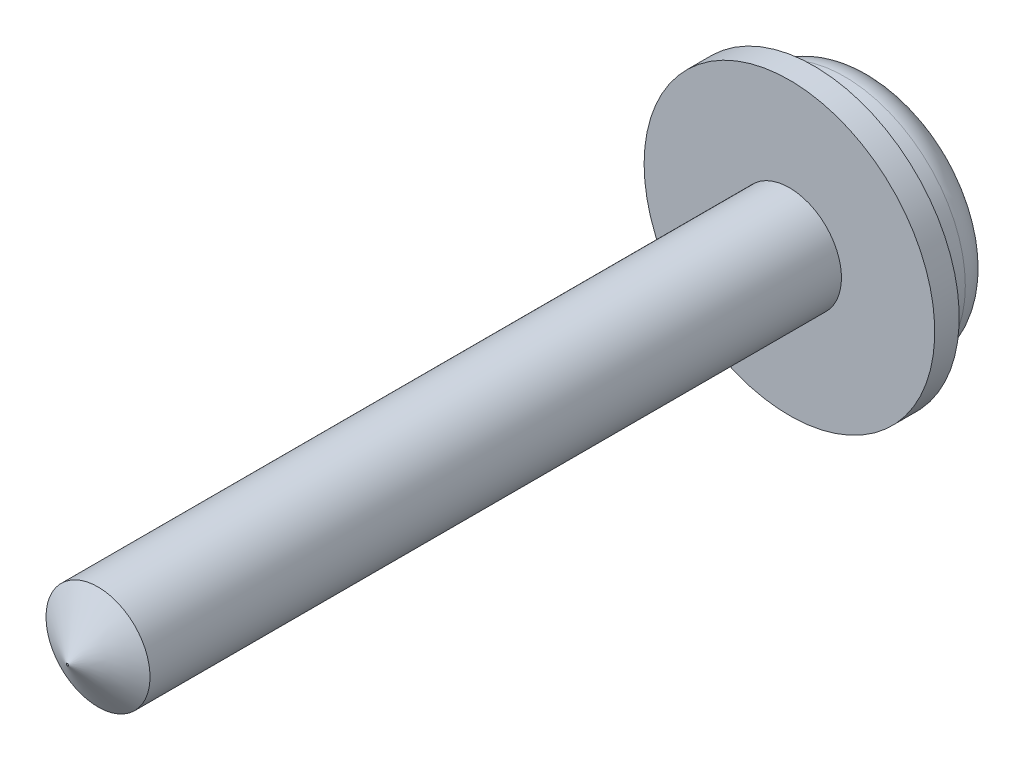
ISO-10303-21;
HEADER;
FILE_DESCRIPTION(('STEP AP214'),'2;1');
FILE_NAME('part.step','',(''),(''),'','','');
FILE_SCHEMA(('AUTOMOTIVE_DESIGN { 1 0 10303 214 1 1 1 1 }'));
ENDSEC;
DATA;
#1=APPLICATION_CONTEXT('core data for automotive mechanical design processes');
#2=APPLICATION_PROTOCOL_DEFINITION('international standard','automotive_design',2000,#1);
#3=PRODUCT_CONTEXT('',#1,'mechanical');
#4=PRODUCT('Part','Part','',(#3));
#5=PRODUCT_RELATED_PRODUCT_CATEGORY('part','',(#4));
#6=PRODUCT_DEFINITION_FORMATION('','',#4);
#7=PRODUCT_DEFINITION_CONTEXT('part definition',#1,'design');
#8=PRODUCT_DEFINITION('design','',#6,#7);
#9=PRODUCT_DEFINITION_SHAPE('','',#8);
#10=(LENGTH_UNIT() NAMED_UNIT(*) SI_UNIT(.MILLI.,.METRE.));
#11=(NAMED_UNIT(*) PLANE_ANGLE_UNIT() SI_UNIT($,.RADIAN.));
#12=(NAMED_UNIT(*) SI_UNIT($,.STERADIAN.) SOLID_ANGLE_UNIT());
#13=UNCERTAINTY_MEASURE_WITH_UNIT(LENGTH_MEASURE(1.E-05),#10,'distance_accuracy_value','');
#14=(GEOMETRIC_REPRESENTATION_CONTEXT(3) GLOBAL_UNCERTAINTY_ASSIGNED_CONTEXT((#13)) GLOBAL_UNIT_ASSIGNED_CONTEXT((#10,
#11,#12)) REPRESENTATION_CONTEXT('',''));
#15=CARTESIAN_POINT('',(0.,0.,0.));
#16=DIRECTION('',(0.,0.,1.));
#17=DIRECTION('',(1.,0.,0.));
#18=AXIS2_PLACEMENT_3D('',#15,#16,#17);
#19=CARTESIAN_POINT('',(0.,0.,-1.4));
#20=DIRECTION('',(0.,0.,-1.));
#21=DIRECTION('',(-1.,0.,0.));
#22=AXIS2_PLACEMENT_3D('',#19,#20,#21);
#23=PLANE('',#22);
#24=CARTESIAN_POINT('',(0.,0.,-1.4));
#25=DIRECTION('',(0.,0.,-1.));
#26=DIRECTION('',(-1.,0.,0.));
#27=AXIS2_PLACEMENT_3D('',#24,#25,#26);
#28=CIRCLE('',#27,1.475);
#29=CARTESIAN_POINT('',(-1.475,0.,-1.4));
#30=VERTEX_POINT('',#29);
#31=EDGE_CURVE('E43',#30,#30,#28,.T.);
#32=ORIENTED_EDGE('',*,*,#31,.T.);
#33=EDGE_LOOP('',(#32));
#34=FACE_BOUND('',#33,.T.);
#35=DIRECTION('',(0.,-1.,0.));
#36=VECTOR('',#35,1.);
#37=CARTESIAN_POINT('',(0.3,0.600000000000002,-1.4));
#38=LINE('',#37,#36);
#39=CARTESIAN_POINT('',(0.3,1.15,-1.4));
#40=VERTEX_POINT('',#39);
#41=CARTESIAN_POINT('',(0.3,0.6,-1.4));
#42=VERTEX_POINT('',#41);
#43=EDGE_CURVE('E50',#40,#42,#38,.T.);
#44=ORIENTED_EDGE('',*,*,#43,.F.);
#45=DIRECTION('',(1.,0.,0.));
#46=VECTOR('',#45,1.);
#47=CARTESIAN_POINT('',(-0.3,1.15,-1.4));
#48=LINE('',#47,#46);
#49=CARTESIAN_POINT('',(-0.3,1.15,-1.4));
#50=VERTEX_POINT('',#49);
#51=EDGE_CURVE('E223',#50,#40,#48,.T.);
#52=ORIENTED_EDGE('',*,*,#51,.F.);
#53=DIRECTION('',(0.,1.,0.));
#54=VECTOR('',#53,1.);
#55=CARTESIAN_POINT('',(-0.3,0.600000000000002,-1.4));
#56=LINE('',#55,#54);
#57=CARTESIAN_POINT('',(-0.3,0.600000000000002,-1.4));
#58=VERTEX_POINT('',#57);
#59=EDGE_CURVE('E221',#58,#50,#56,.T.);
#60=ORIENTED_EDGE('',*,*,#59,.F.);
#61=CARTESIAN_POINT('',(-0.6,0.6,-1.4));
#62=DIRECTION('',(0.,0.,1.));
#63=DIRECTION('',(-1.,0.,0.));
#64=AXIS2_PLACEMENT_3D('',#61,#62,#63);
#65=CIRCLE('',#64,0.3);
#66=CARTESIAN_POINT('',(-0.600000000000002,0.3,-1.4));
#67=VERTEX_POINT('',#66);
#68=EDGE_CURVE('E158',#67,#58,#65,.T.);
#69=ORIENTED_EDGE('',*,*,#68,.F.);
#70=DIRECTION('',(1.,0.,0.));
#71=VECTOR('',#70,1.);
#72=CARTESIAN_POINT('',(-1.15,0.3,-1.4));
#73=LINE('',#72,#71);
#74=CARTESIAN_POINT('',(-1.15,0.3,-1.4));
#75=VERTEX_POINT('',#74);
#76=EDGE_CURVE('E217',#75,#67,#73,.T.);
#77=ORIENTED_EDGE('',*,*,#76,.F.);
#78=DIRECTION('',(0.,1.,0.));
#79=VECTOR('',#78,1.);
#80=CARTESIAN_POINT('',(-1.15,-0.3,-1.4));
#81=LINE('',#80,#79);
#82=CARTESIAN_POINT('',(-1.15,-0.3,-1.4));
#83=VERTEX_POINT('',#82);
#84=EDGE_CURVE('E214',#83,#75,#81,.T.);
#85=ORIENTED_EDGE('',*,*,#84,.F.);
#86=DIRECTION('',(-1.,0.,0.));
#87=VECTOR('',#86,1.);
#88=CARTESIAN_POINT('',(-1.15,-0.3,-1.4));
#89=LINE('',#88,#87);
#90=CARTESIAN_POINT('',(-0.600000000000002,-0.3,-1.4));
#91=VERTEX_POINT('',#90);
#92=EDGE_CURVE('E211',#91,#83,#89,.T.);
#93=ORIENTED_EDGE('',*,*,#92,.F.);
#94=CARTESIAN_POINT('',(-0.6,-0.6,-1.4));
#95=DIRECTION('',(0.,0.,1.));
#96=DIRECTION('',(1.,0.,0.));
#97=AXIS2_PLACEMENT_3D('',#94,#95,#96);
#98=CIRCLE('',#97,0.3);
#99=CARTESIAN_POINT('',(-0.3,-0.600000000000002,-1.4));
#100=VERTEX_POINT('',#99);
#101=EDGE_CURVE('E208',#100,#91,#98,.T.);
#102=ORIENTED_EDGE('',*,*,#101,.F.);
#103=DIRECTION('',(0.,1.,0.));
#104=VECTOR('',#103,1.);
#105=CARTESIAN_POINT('',(-0.3,-1.15,-1.4));
#106=LINE('',#105,#104);
#107=CARTESIAN_POINT('',(-0.3,-1.15,-1.4));
#108=VERTEX_POINT('',#107);
#109=EDGE_CURVE('E205',#108,#100,#106,.T.);
#110=ORIENTED_EDGE('',*,*,#109,.F.);
#111=DIRECTION('',(-1.,0.,0.));
#112=VECTOR('',#111,1.);
#113=CARTESIAN_POINT('',(-0.3,-1.15,-1.4));
#114=LINE('',#113,#112);
#115=CARTESIAN_POINT('',(0.3,-1.15,-1.4));
#116=VERTEX_POINT('',#115);
#117=EDGE_CURVE('E202',#116,#108,#114,.T.);
#118=ORIENTED_EDGE('',*,*,#117,.F.);
#119=DIRECTION('',(0.,-1.,0.));
#120=VECTOR('',#119,1.);
#121=CARTESIAN_POINT('',(0.3,-1.15,-1.4));
#122=LINE('',#121,#120);
#123=CARTESIAN_POINT('',(0.3,-0.600000000000002,-1.4));
#124=VERTEX_POINT('',#123);
#125=EDGE_CURVE('E199',#124,#116,#122,.T.);
#126=ORIENTED_EDGE('',*,*,#125,.F.);
#127=CARTESIAN_POINT('',(0.6,-0.6,-1.4));
#128=DIRECTION('',(0.,0.,1.));
#129=DIRECTION('',(1.,0.,0.));
#130=AXIS2_PLACEMENT_3D('',#127,#128,#129);
#131=CIRCLE('',#130,0.3);
#132=CARTESIAN_POINT('',(0.600000000000002,-0.3,-1.4));
#133=VERTEX_POINT('',#132);
#134=EDGE_CURVE('E196',#133,#124,#131,.T.);
#135=ORIENTED_EDGE('',*,*,#134,.F.);
#136=DIRECTION('',(-1.,0.,0.));
#137=VECTOR('',#136,1.);
#138=CARTESIAN_POINT('',(0.600000000000002,-0.3,-1.4));
#139=LINE('',#138,#137);
#140=CARTESIAN_POINT('',(1.15,-0.3,-1.4));
#141=VERTEX_POINT('',#140);
#142=EDGE_CURVE('E193',#141,#133,#139,.T.);
#143=ORIENTED_EDGE('',*,*,#142,.F.);
#144=DIRECTION('',(0.,-1.,0.));
#145=VECTOR('',#144,1.);
#146=CARTESIAN_POINT('',(1.15,-0.3,-1.4));
#147=LINE('',#146,#145);
#148=CARTESIAN_POINT('',(1.15,0.3,-1.4));
#149=VERTEX_POINT('',#148);
#150=EDGE_CURVE('E190',#149,#141,#147,.T.);
#151=ORIENTED_EDGE('',*,*,#150,.F.);
#152=DIRECTION('',(1.,0.,0.));
#153=VECTOR('',#152,1.);
#154=CARTESIAN_POINT('',(0.600000000000002,0.3,-1.4));
#155=LINE('',#154,#153);
#156=CARTESIAN_POINT('',(0.600000000000002,0.3,-1.4));
#157=VERTEX_POINT('',#156);
#158=EDGE_CURVE('E187',#157,#149,#155,.T.);
#159=ORIENTED_EDGE('',*,*,#158,.F.);
#160=CARTESIAN_POINT('',(0.6,0.6,-1.4));
#161=DIRECTION('',(0.,0.,1.));
#162=DIRECTION('',(-1.,0.,0.));
#163=AXIS2_PLACEMENT_3D('',#160,#161,#162);
#164=CIRCLE('',#163,0.3);
#165=EDGE_CURVE('E184',#42,#157,#164,.T.);
#166=ORIENTED_EDGE('',*,*,#165,.F.);
#167=EDGE_LOOP('',(#44,#52,#60,#69,#77,#85,#93,#102,#110,#118,#126,#135,#143,#151,#159,#166));
#168=FACE_BOUND('',#167,.T.);
#169=ADVANCED_FACE('F35',(#34,#168),#23,.T.);
#170=CARTESIAN_POINT('',(0.,0.,11.8));
#171=DIRECTION('',(0.,0.,-1.));
#172=DIRECTION('',(-1.,0.,0.));
#173=AXIS2_PLACEMENT_3D('',#170,#171,#172);
#174=CYLINDRICAL_SURFACE('',#173,0.85);
#175=CARTESIAN_POINT('',(0.,0.,11.3));
#176=DIRECTION('',(0.,0.,1.));
#177=DIRECTION('',(1.,0.,0.));
#178=AXIS2_PLACEMENT_3D('',#175,#176,#177);
#179=CIRCLE('',#178,0.85);
#180=CARTESIAN_POINT('',(-0.850000000000001,0.,11.3));
#181=VERTEX_POINT('',#180);
#182=EDGE_CURVE('E267',#181,#181,#179,.F.);
#183=ORIENTED_EDGE('',*,*,#182,.T.);
#184=EDGE_LOOP('',(#183));
#185=FACE_BOUND('',#184,.T.);
#186=CARTESIAN_POINT('',(0.,0.,0.));
#187=DIRECTION('',(0.,0.,-1.));
#188=DIRECTION('',(-1.,0.,0.));
#189=AXIS2_PLACEMENT_3D('',#186,#187,#188);
#190=CIRCLE('',#189,0.85);
#191=CARTESIAN_POINT('',(-0.85,0.,0.));
#192=VERTEX_POINT('',#191);
#193=EDGE_CURVE('E259',#192,#192,#190,.T.);
#194=ORIENTED_EDGE('',*,*,#193,.F.);
#195=EDGE_LOOP('',(#194));
#196=FACE_BOUND('',#195,.T.);
#197=ADVANCED_FACE('F289',(#185,#196),#174,.T.);
#198=CARTESIAN_POINT('',(0.,0.,11.8));
#199=DIRECTION('',(0.,0.,1.));
#200=DIRECTION('',(1.,0.,0.));
#201=AXIS2_PLACEMENT_3D('',#198,#199,#200);
#202=PLANE('',#201);
#203=CARTESIAN_POINT('',(0.,0.,11.8));
#204=DIRECTION('',(0.,0.,1.));
#205=DIRECTION('',(1.,0.,0.));
#206=AXIS2_PLACEMENT_3D('',#203,#204,#205);
#207=CIRCLE('',#206,0.0178602588247426);
#208=CARTESIAN_POINT('',(-0.0178602588247441,0.,11.8));
#209=VERTEX_POINT('',#208);
#210=EDGE_CURVE('E264',#209,#209,#207,.T.);
#211=ORIENTED_EDGE('',*,*,#210,.T.);
#212=EDGE_LOOP('',(#211));
#213=FACE_BOUND('',#212,.T.);
#214=ADVANCED_FACE('F294',(#213),#202,.T.);
#215=CARTESIAN_POINT('',(0.,0.,11.8));
#216=DIRECTION('',(0.,0.,-1.));
#217=DIRECTION('',(-1.,0.,0.));
#218=AXIS2_PLACEMENT_3D('',#215,#216,#217);
#219=CONICAL_SURFACE('',#218,0.0178602588247426,1.02974425867665);
#220=CARTESIAN_POINT('',(-0.850000000000001,0.,11.3));
#221=CARTESIAN_POINT('',(-0.841331877696093,0.,11.3052083333333));
#222=CARTESIAN_POINT('',(-0.832663755392184,0.,11.3104166666667));
#223=CARTESIAN_POINT('',(-0.815327510784366,0.,11.3208333333333));
#224=CARTESIAN_POINT('',(-0.806659388480457,0.,11.3260416666667));
#225=CARTESIAN_POINT('',(-0.789323143872639,0.,11.3364583333333));
#226=CARTESIAN_POINT('',(-0.78065502156873,0.,11.3416666666667));
#227=CARTESIAN_POINT('',(-0.763318776960912,0.,11.3520833333333));
#228=CARTESIAN_POINT('',(-0.754650654657003,0.,11.3572916666667));
#229=CARTESIAN_POINT('',(-0.737314410049185,0.,11.3677083333333));
#230=CARTESIAN_POINT('',(-0.728646287745277,0.,11.3729166666667));
#231=CARTESIAN_POINT('',(-0.711310043137459,0.,11.3833333333333));
#232=CARTESIAN_POINT('',(-0.70264192083355,0.,11.3885416666667));
#233=CARTESIAN_POINT('',(-0.685305676225732,0.,11.3989583333333));
#234=CARTESIAN_POINT('',(-0.676637553921823,0.,11.4041666666667));
#235=CARTESIAN_POINT('',(-0.659301309314005,0.,11.4145833333333));
#236=CARTESIAN_POINT('',(-0.650633187010096,0.,11.4197916666667));
#237=CARTESIAN_POINT('',(-0.633296942402278,0.,11.4302083333333));
#238=CARTESIAN_POINT('',(-0.624628820098369,0.,11.4354166666667));
#239=CARTESIAN_POINT('',(-0.607292575490551,0.,11.4458333333333));
#240=CARTESIAN_POINT('',(-0.598624453186642,0.,11.4510416666667));
#241=CARTESIAN_POINT('',(-0.581288208578825,0.,11.4614583333333));
#242=CARTESIAN_POINT('',(-0.572620086274916,0.,11.4666666666667));
#243=CARTESIAN_POINT('',(-0.555283841667098,0.,11.4770833333333));
#244=CARTESIAN_POINT('',(-0.546615719363189,0.,11.4822916666667));
#245=CARTESIAN_POINT('',(-0.529279474755371,0.,11.4927083333333));
#246=CARTESIAN_POINT('',(-0.520611352451462,0.,11.4979166666667));
#247=CARTESIAN_POINT('',(-0.503275107843644,0.,11.5083333333333));
#248=CARTESIAN_POINT('',(-0.494606985539735,0.,11.5135416666667));
#249=CARTESIAN_POINT('',(-0.477270740931917,0.,11.5239583333333));
#250=CARTESIAN_POINT('',(-0.468602618628009,0.,11.5291666666667));
#251=CARTESIAN_POINT('',(-0.451266374020191,0.,11.5395833333333));
#252=CARTESIAN_POINT('',(-0.442598251716282,0.,11.5447916666667));
#253=CARTESIAN_POINT('',(-0.425262007108464,0.,11.5552083333333));
#254=CARTESIAN_POINT('',(-0.416593884804555,0.,11.5604166666667));
#255=CARTESIAN_POINT('',(-0.399257640196737,0.,11.5708333333333));
#256=CARTESIAN_POINT('',(-0.390589517892828,0.,11.5760416666667));
#257=CARTESIAN_POINT('',(-0.37325327328501,0.,11.5864583333333));
#258=CARTESIAN_POINT('',(-0.364585150981101,0.,11.5916666666667));
#259=CARTESIAN_POINT('',(-0.347248906373283,0.,11.6020833333333));
#260=CARTESIAN_POINT('',(-0.338580784069375,0.,11.6072916666667));
#261=CARTESIAN_POINT('',(-0.321244539461557,0.,11.6177083333333));
#262=CARTESIAN_POINT('',(-0.312576417157648,0.,11.6229166666667));
#263=CARTESIAN_POINT('',(-0.29524017254983,0.,11.6333333333333));
#264=CARTESIAN_POINT('',(-0.286572050245921,0.,11.6385416666667));
#265=CARTESIAN_POINT('',(-0.269235805638103,0.,11.6489583333333));
#266=CARTESIAN_POINT('',(-0.260567683334194,0.,11.6541666666667));
#267=CARTESIAN_POINT('',(-0.243231438726376,0.,11.6645833333333));
#268=CARTESIAN_POINT('',(-0.234563316422467,0.,11.6697916666667));
#269=CARTESIAN_POINT('',(-0.21722707181465,0.,11.6802083333333));
#270=CARTESIAN_POINT('',(-0.208558949510741,0.,11.6854166666667));
#271=CARTESIAN_POINT('',(-0.191222704902923,0.,11.6958333333333));
#272=CARTESIAN_POINT('',(-0.182554582599014,0.,11.7010416666667));
#273=CARTESIAN_POINT('',(-0.165218337991196,0.,11.7114583333333));
#274=CARTESIAN_POINT('',(-0.156550215687287,0.,11.7166666666667));
#275=CARTESIAN_POINT('',(-0.139213971079469,0.,11.7270833333333));
#276=CARTESIAN_POINT('',(-0.13054584877556,0.,11.7322916666667));
#277=CARTESIAN_POINT('',(-0.113209604167742,0.,11.7427083333333));
#278=CARTESIAN_POINT('',(-0.104541481863833,0.,11.7479166666667));
#279=CARTESIAN_POINT('',(-0.0872052372560155,0.,11.7583333333333));
#280=CARTESIAN_POINT('',(-0.0785371149521066,0.,11.7635416666667));
#281=CARTESIAN_POINT('',(-0.0612008703442887,0.,11.7739583333333));
#282=CARTESIAN_POINT('',(-0.0525327480403797,0.,11.7791666666667));
#283=CARTESIAN_POINT('',(-0.0351965034325618,0.,11.7895833333333));
#284=CARTESIAN_POINT('',(-0.0265283811286528,0.,11.7947916666667));
#285=CARTESIAN_POINT('',(-0.0178602588247441,0.,11.8));
#286=B_SPLINE_CURVE_WITH_KNOTS('',3,(#220,#221,#222,#223,#224,#225,#226,#227,#228,#229,#230,
#231,#232,#233,#234,#235,#236,#237,#238,#239,#240,#241,#242,#243,#244,#245,#246,#247,#248,#249,
#250,#251,#252,#253,#254,#255,#256,#257,#258,#259,#260,#261,#262,#263,#264,#265,#266,#267,#268,
#269,#270,#271,#272,#273,#274,#275,#276,#277,#278,#279,#280,#281,#282,#283,#284,#285),
.UNSPECIFIED.,.F.,.F.,(4,2,2,2,2,2,2,2,2,2,2,2,2,2,2,2,2,2,2,2,2,2,2,2,2,2,2,2,2,2,2,2,4),(0.,
0.0303375629126626,0.0606751258253245,0.0910126887379862,0.121350251650648,0.15168781456331,
0.182025377475972,0.212362940388633,0.242700503301295,0.273038066213957,0.303375629126619,
0.333713192039281,0.364050754951942,0.394388317864604,0.424725880777266,0.455063443689928,
0.485401006602589,0.515738569515251,0.546076132427913,0.576413695340575,0.606751258253236,
0.637088821165898,0.66742638407856,0.697763946991222,0.728101509903883,0.758439072816545,
0.788776635729207,0.819114198641869,0.849451761554531,0.879789324467192,0.910126887379854,
0.940464450292516,0.970802013205178),.UNSPECIFIED.);
#287=EDGE_CURVE('BSEAM309',#181,#209,#286,.T.);
#288=ORIENTED_EDGE('',*,*,#182,.F.);
#289=ORIENTED_EDGE('',*,*,#210,.F.);
#290=ORIENTED_EDGE('',*,*,#287,.T.);
#291=ORIENTED_EDGE('',*,*,#287,.F.);
#292=EDGE_LOOP('',(#288,#290,#289,#291));
#293=FACE_BOUND('',#292,.T.);
#294=ADVANCED_FACE('F309',(#293),#219,.T.);
#295=CARTESIAN_POINT('',(0.,0.,-0.4));
#296=DIRECTION('',(0.,0.,1.));
#297=DIRECTION('',(1.,0.,0.));
#298=AXIS2_PLACEMENT_3D('',#295,#296,#297);
#299=CYLINDRICAL_SURFACE('',#298,2.375);
#300=CARTESIAN_POINT('',(0.,0.,-0.4));
#301=DIRECTION('',(0.,0.,-1.));
#302=DIRECTION('',(-1.,0.,0.));
#303=AXIS2_PLACEMENT_3D('',#300,#301,#302);
#304=CIRCLE('',#303,2.375);
#305=CARTESIAN_POINT('',(-2.375,0.,-0.4));
#306=VERTEX_POINT('',#305);
#307=EDGE_CURVE('E256',#306,#306,#304,.T.);
#308=ORIENTED_EDGE('',*,*,#307,.F.);
#309=EDGE_LOOP('',(#308));
#310=FACE_BOUND('',#309,.T.);
#311=CARTESIAN_POINT('',(0.,0.,0.));
#312=DIRECTION('',(0.,0.,-1.));
#313=DIRECTION('',(-1.,0.,0.));
#314=AXIS2_PLACEMENT_3D('',#311,#312,#313);
#315=CIRCLE('',#314,2.375);
#316=CARTESIAN_POINT('',(-2.375,0.,0.));
#317=VERTEX_POINT('',#316);
#318=EDGE_CURVE('E255',#317,#317,#315,.T.);
#319=ORIENTED_EDGE('',*,*,#318,.T.);
#320=EDGE_LOOP('',(#319));
#321=FACE_BOUND('',#320,.T.);
#322=ADVANCED_FACE('F302',(#310,#321),#299,.T.);
#323=CARTESIAN_POINT('',(0.,0.,-0.4));
#324=DIRECTION('',(0.,0.,-1.));
#325=DIRECTION('',(-1.,0.,0.));
#326=AXIS2_PLACEMENT_3D('',#323,#324,#325);
#327=PLANE('',#326);
#328=CARTESIAN_POINT('',(0.,0.,-0.4));
#329=DIRECTION('',(0.,0.,-1.));
#330=DIRECTION('',(-1.,0.,0.));
#331=AXIS2_PLACEMENT_3D('',#328,#329,#330);
#332=CIRCLE('',#331,1.975);
#333=CARTESIAN_POINT('',(-1.975,0.,-0.4));
#334=VERTEX_POINT('',#333);
#335=EDGE_CURVE('E227',#334,#334,#332,.T.);
#336=ORIENTED_EDGE('',*,*,#335,.F.);
#337=EDGE_LOOP('',(#336));
#338=FACE_BOUND('',#337,.T.);
#339=ORIENTED_EDGE('',*,*,#307,.T.);
#340=EDGE_LOOP('',(#339));
#341=FACE_BOUND('',#340,.T.);
#342=ADVANCED_FACE('F299',(#338,#341),#327,.T.);
#343=CARTESIAN_POINT('',(0.,0.,0.));
#344=DIRECTION('',(0.,0.,-1.));
#345=DIRECTION('',(-1.,0.,0.));
#346=AXIS2_PLACEMENT_3D('',#343,#344,#345);
#347=PLANE('',#346);
#348=ORIENTED_EDGE('',*,*,#193,.T.);
#349=EDGE_LOOP('',(#348));
#350=FACE_BOUND('',#349,.T.);
#351=ORIENTED_EDGE('',*,*,#318,.F.);
#352=EDGE_LOOP('',(#351));
#353=FACE_BOUND('',#352,.T.);
#354=ADVANCED_FACE('F284',(#350,#353),#347,.F.);
#355=CARTESIAN_POINT('',(0.,0.,-1.4));
#356=DIRECTION('',(0.,0.,1.));
#357=DIRECTION('',(1.,0.,0.));
#358=AXIS2_PLACEMENT_3D('',#355,#356,#357);
#359=CYLINDRICAL_SURFACE('',#358,1.975);
#360=CARTESIAN_POINT('',(0.,0.,-0.9));
#361=DIRECTION('',(0.,0.,-1.));
#362=DIRECTION('',(-1.,0.,0.));
#363=AXIS2_PLACEMENT_3D('',#360,#361,#362);
#364=CIRCLE('',#363,1.975);
#365=CARTESIAN_POINT('',(-1.975,0.,-0.9));
#366=VERTEX_POINT('',#365);
#367=EDGE_CURVE('E11',#366,#366,#364,.F.);
#368=ORIENTED_EDGE('',*,*,#367,.T.);
#369=EDGE_LOOP('',(#368));
#370=FACE_BOUND('',#369,.T.);
#371=ORIENTED_EDGE('',*,*,#335,.T.);
#372=EDGE_LOOP('',(#371));
#373=FACE_BOUND('',#372,.T.);
#374=ADVANCED_FACE('F276',(#370,#373),#359,.T.);
#375=CARTESIAN_POINT('',(0.,0.,-0.9));
#376=DIRECTION('',(0.,0.,-1.));
#377=DIRECTION('',(-1.,0.,0.));
#378=AXIS2_PLACEMENT_3D('',#375,#376,#377);
#379=TOROIDAL_SURFACE('',#378,1.475,0.5);
#380=ORIENTED_EDGE('',*,*,#367,.F.);
#381=EDGE_LOOP('',(#380));
#382=FACE_BOUND('',#381,.T.);
#383=ORIENTED_EDGE('',*,*,#31,.F.);
#384=EDGE_LOOP('',(#383));
#385=FACE_BOUND('',#384,.T.);
#386=ADVANCED_FACE('F37',(#382,#385),#379,.T.);
#387=CARTESIAN_POINT('',(0.3,0.600000000000002,-0.4));
#388=DIRECTION('',(1.,0.,0.));
#389=DIRECTION('',(0.,1.,0.));
#390=AXIS2_PLACEMENT_3D('',#387,#388,#389);
#391=PLANE('',#390);
#392=ORIENTED_EDGE('',*,*,#43,.T.);
#393=DIRECTION('',(0.,0.,-1.));
#394=VECTOR('',#393,1.);
#395=CARTESIAN_POINT('',(0.3,0.6,-0.4));
#396=LINE('',#395,#394);
#397=CARTESIAN_POINT('',(0.3,0.6,-0.4));
#398=VERTEX_POINT('',#397);
#399=EDGE_CURVE('E110',#398,#42,#396,.T.);
#400=ORIENTED_EDGE('',*,*,#399,.F.);
#401=DIRECTION('',(0.,-1.,0.));
#402=VECTOR('',#401,1.);
#403=CARTESIAN_POINT('',(0.3,0.600000000000002,-0.4));
#404=LINE('',#403,#402);
#405=CARTESIAN_POINT('',(0.3,1.15,-0.4));
#406=VERTEX_POINT('',#405);
#407=EDGE_CURVE('E225',#406,#398,#404,.T.);
#408=ORIENTED_EDGE('',*,*,#407,.F.);
#409=DIRECTION('',(0.,0.,-1.));
#410=VECTOR('',#409,1.);
#411=CARTESIAN_POINT('',(0.3,1.15,-0.4));
#412=LINE('',#411,#410);
#413=EDGE_CURVE('E58',#406,#40,#412,.T.);
#414=ORIENTED_EDGE('',*,*,#413,.T.);
#415=EDGE_LOOP('',(#392,#400,#408,#414));
#416=FACE_BOUND('',#415,.T.);
#417=ADVANCED_FACE('F275',(#416),#391,.F.);
#418=CARTESIAN_POINT('',(-0.3,1.15,-0.4));
#419=DIRECTION('',(0.,1.,0.));
#420=DIRECTION('',(0.,0.,1.));
#421=AXIS2_PLACEMENT_3D('',#418,#419,#420);
#422=PLANE('',#421);
#423=ORIENTED_EDGE('',*,*,#51,.T.);
#424=ORIENTED_EDGE('',*,*,#413,.F.);
#425=DIRECTION('',(1.,0.,0.));
#426=VECTOR('',#425,1.);
#427=CARTESIAN_POINT('',(-0.3,1.15,-0.4));
#428=LINE('',#427,#426);
#429=CARTESIAN_POINT('',(-0.3,1.15,-0.4));
#430=VERTEX_POINT('',#429);
#431=EDGE_CURVE('E170',#430,#406,#428,.T.);
#432=ORIENTED_EDGE('',*,*,#431,.F.);
#433=DIRECTION('',(0.,0.,-1.));
#434=VECTOR('',#433,1.);
#435=CARTESIAN_POINT('',(-0.3,1.15,-0.4));
#436=LINE('',#435,#434);
#437=EDGE_CURVE('E162',#430,#50,#436,.T.);
#438=ORIENTED_EDGE('',*,*,#437,.T.);
#439=EDGE_LOOP('',(#423,#424,#432,#438));
#440=FACE_BOUND('',#439,.T.);
#441=ADVANCED_FACE('F282',(#440),#422,.F.);
#442=CARTESIAN_POINT('',(-0.3,0.600000000000002,-0.4));
#443=DIRECTION('',(-1.,0.,0.));
#444=DIRECTION('',(0.,0.,1.));
#445=AXIS2_PLACEMENT_3D('',#442,#443,#444);
#446=PLANE('',#445);
#447=ORIENTED_EDGE('',*,*,#59,.T.);
#448=ORIENTED_EDGE('',*,*,#437,.F.);
#449=DIRECTION('',(0.,1.,0.));
#450=VECTOR('',#449,1.);
#451=CARTESIAN_POINT('',(-0.3,0.600000000000002,-0.4));
#452=LINE('',#451,#450);
#453=CARTESIAN_POINT('',(-0.3,0.600000000000002,-0.4));
#454=VERTEX_POINT('',#453);
#455=EDGE_CURVE('E166',#454,#430,#452,.T.);
#456=ORIENTED_EDGE('',*,*,#455,.F.);
#457=DIRECTION('',(0.,0.,-1.));
#458=VECTOR('',#457,1.);
#459=CARTESIAN_POINT('',(-0.3,0.600000000000002,-0.4));
#460=LINE('',#459,#458);
#461=EDGE_CURVE('E151',#454,#58,#460,.T.);
#462=ORIENTED_EDGE('',*,*,#461,.T.);
#463=EDGE_LOOP('',(#447,#448,#456,#462));
#464=FACE_BOUND('',#463,.T.);
#465=ADVANCED_FACE('F167',(#464),#446,.F.);
#466=CARTESIAN_POINT('',(-0.6,0.6,-0.4));
#467=DIRECTION('',(0.,0.,-1.));
#468=DIRECTION('',(-1.,0.,0.));
#469=AXIS2_PLACEMENT_3D('',#466,#467,#468);
#470=CYLINDRICAL_SURFACE('',#469,0.3);
#471=ORIENTED_EDGE('',*,*,#68,.T.);
#472=ORIENTED_EDGE('',*,*,#461,.F.);
#473=CARTESIAN_POINT('',(-0.6,0.6,-0.4));
#474=DIRECTION('',(0.,0.,1.));
#475=DIRECTION('',(-1.,0.,0.));
#476=AXIS2_PLACEMENT_3D('',#473,#474,#475);
#477=CIRCLE('',#476,0.3);
#478=CARTESIAN_POINT('',(-0.600000000000002,0.3,-0.4));
#479=VERTEX_POINT('',#478);
#480=EDGE_CURVE('E155',#479,#454,#477,.T.);
#481=ORIENTED_EDGE('',*,*,#480,.F.);
#482=DIRECTION('',(0.,0.,-1.));
#483=VECTOR('',#482,1.);
#484=CARTESIAN_POINT('',(-0.600000000000002,0.3,-0.4));
#485=LINE('',#484,#483);
#486=EDGE_CURVE('E163',#479,#67,#485,.T.);
#487=ORIENTED_EDGE('',*,*,#486,.T.);
#488=EDGE_LOOP('',(#471,#472,#481,#487));
#489=FACE_BOUND('',#488,.T.);
#490=ADVANCED_FACE('F153',(#489),#470,.T.);
#491=CARTESIAN_POINT('',(-1.15,0.3,-0.4));
#492=DIRECTION('',(0.,1.,0.));
#493=DIRECTION('',(-1.,0.,0.));
#494=AXIS2_PLACEMENT_3D('',#491,#492,#493);
#495=PLANE('',#494);
#496=ORIENTED_EDGE('',*,*,#76,.T.);
#497=ORIENTED_EDGE('',*,*,#486,.F.);
#498=DIRECTION('',(1.,0.,0.));
#499=VECTOR('',#498,1.);
#500=CARTESIAN_POINT('',(-1.15,0.3,-0.4));
#501=LINE('',#500,#499);
#502=CARTESIAN_POINT('',(-1.15,0.3,-0.4));
#503=VERTEX_POINT('',#502);
#504=EDGE_CURVE('E176',#503,#479,#501,.T.);
#505=ORIENTED_EDGE('',*,*,#504,.F.);
#506=DIRECTION('',(0.,0.,-1.));
#507=VECTOR('',#506,1.);
#508=CARTESIAN_POINT('',(-1.15,0.3,-0.4));
#509=LINE('',#508,#507);
#510=EDGE_CURVE('E230',#503,#75,#509,.T.);
#511=ORIENTED_EDGE('',*,*,#510,.T.);
#512=EDGE_LOOP('',(#496,#497,#505,#511));
#513=FACE_BOUND('',#512,.T.);
#514=ADVANCED_FACE('F382',(#513),#495,.F.);
#515=CARTESIAN_POINT('',(-1.15,-0.3,-0.4));
#516=DIRECTION('',(-1.,0.,0.));
#517=DIRECTION('',(0.,0.,1.));
#518=AXIS2_PLACEMENT_3D('',#515,#516,#517);
#519=PLANE('',#518);
#520=ORIENTED_EDGE('',*,*,#84,.T.);
#521=ORIENTED_EDGE('',*,*,#510,.F.);
#522=DIRECTION('',(0.,1.,0.));
#523=VECTOR('',#522,1.);
#524=CARTESIAN_POINT('',(-1.15,-0.3,-0.4));
#525=LINE('',#524,#523);
#526=CARTESIAN_POINT('',(-1.15,-0.3,-0.4));
#527=VERTEX_POINT('',#526);
#528=EDGE_CURVE('E178',#527,#503,#525,.T.);
#529=ORIENTED_EDGE('',*,*,#528,.F.);
#530=DIRECTION('',(0.,0.,-1.));
#531=VECTOR('',#530,1.);
#532=CARTESIAN_POINT('',(-1.15,-0.3,-0.4));
#533=LINE('',#532,#531);
#534=EDGE_CURVE('E232',#527,#83,#533,.T.);
#535=ORIENTED_EDGE('',*,*,#534,.T.);
#536=EDGE_LOOP('',(#520,#521,#529,#535));
#537=FACE_BOUND('',#536,.T.);
#538=ADVANCED_FACE('F391',(#537),#519,.F.);
#539=CARTESIAN_POINT('',(-1.15,-0.3,-0.4));
#540=DIRECTION('',(0.,-1.,0.));
#541=DIRECTION('',(1.,0.,0.));
#542=AXIS2_PLACEMENT_3D('',#539,#540,#541);
#543=PLANE('',#542);
#544=ORIENTED_EDGE('',*,*,#92,.T.);
#545=ORIENTED_EDGE('',*,*,#534,.F.);
#546=DIRECTION('',(-1.,0.,0.));
#547=VECTOR('',#546,1.);
#548=CARTESIAN_POINT('',(-1.15,-0.3,-0.4));
#549=LINE('',#548,#547);
#550=CARTESIAN_POINT('',(-0.600000000000002,-0.3,-0.4));
#551=VERTEX_POINT('',#550);
#552=EDGE_CURVE('E547',#551,#527,#549,.T.);
#553=ORIENTED_EDGE('',*,*,#552,.F.);
#554=DIRECTION('',(0.,0.,-1.));
#555=VECTOR('',#554,1.);
#556=CARTESIAN_POINT('',(-0.600000000000002,-0.3,-0.4));
#557=LINE('',#556,#555);
#558=EDGE_CURVE('E234',#551,#91,#557,.T.);
#559=ORIENTED_EDGE('',*,*,#558,.T.);
#560=EDGE_LOOP('',(#544,#545,#553,#559));
#561=FACE_BOUND('',#560,.T.);
#562=ADVANCED_FACE('F401',(#561),#543,.F.);
#563=CARTESIAN_POINT('',(-0.6,-0.6,-0.4));
#564=DIRECTION('',(0.,0.,-1.));
#565=DIRECTION('',(-1.,0.,0.));
#566=AXIS2_PLACEMENT_3D('',#563,#564,#565);
#567=CYLINDRICAL_SURFACE('',#566,0.3);
#568=ORIENTED_EDGE('',*,*,#101,.T.);
#569=ORIENTED_EDGE('',*,*,#558,.F.);
#570=CARTESIAN_POINT('',(-0.6,-0.6,-0.4));
#571=DIRECTION('',(0.,0.,1.));
#572=DIRECTION('',(1.,0.,0.));
#573=AXIS2_PLACEMENT_3D('',#570,#571,#572);
#574=CIRCLE('',#573,0.3);
#575=CARTESIAN_POINT('',(-0.3,-0.600000000000002,-0.4));
#576=VERTEX_POINT('',#575);
#577=EDGE_CURVE('E544',#576,#551,#574,.T.);
#578=ORIENTED_EDGE('',*,*,#577,.F.);
#579=DIRECTION('',(0.,0.,-1.));
#580=VECTOR('',#579,1.);
#581=CARTESIAN_POINT('',(-0.3,-0.600000000000002,-0.4));
#582=LINE('',#581,#580);
#583=EDGE_CURVE('E236',#576,#100,#582,.T.);
#584=ORIENTED_EDGE('',*,*,#583,.T.);
#585=EDGE_LOOP('',(#568,#569,#578,#584));
#586=FACE_BOUND('',#585,.T.);
#587=ADVANCED_FACE('F411',(#586),#567,.T.);
#588=CARTESIAN_POINT('',(-0.3,-1.15,-0.4));
#589=DIRECTION('',(-1.,0.,0.));
#590=DIRECTION('',(0.,0.,1.));
#591=AXIS2_PLACEMENT_3D('',#588,#589,#590);
#592=PLANE('',#591);
#593=ORIENTED_EDGE('',*,*,#109,.T.);
#594=ORIENTED_EDGE('',*,*,#583,.F.);
#595=DIRECTION('',(0.,1.,0.));
#596=VECTOR('',#595,1.);
#597=CARTESIAN_POINT('',(-0.3,-1.15,-0.4));
#598=LINE('',#597,#596);
#599=CARTESIAN_POINT('',(-0.3,-1.15,-0.4));
#600=VERTEX_POINT('',#599);
#601=EDGE_CURVE('E541',#600,#576,#598,.T.);
#602=ORIENTED_EDGE('',*,*,#601,.F.);
#603=DIRECTION('',(0.,0.,-1.));
#604=VECTOR('',#603,1.);
#605=CARTESIAN_POINT('',(-0.3,-1.15,-0.4));
#606=LINE('',#605,#604);
#607=EDGE_CURVE('E238',#600,#108,#606,.T.);
#608=ORIENTED_EDGE('',*,*,#607,.T.);
#609=EDGE_LOOP('',(#593,#594,#602,#608));
#610=FACE_BOUND('',#609,.T.);
#611=ADVANCED_FACE('F421',(#610),#592,.F.);
#612=CARTESIAN_POINT('',(-0.3,-1.15,-0.4));
#613=DIRECTION('',(0.,-1.,0.));
#614=DIRECTION('',(0.,0.,-1.));
#615=AXIS2_PLACEMENT_3D('',#612,#613,#614);
#616=PLANE('',#615);
#617=ORIENTED_EDGE('',*,*,#117,.T.);
#618=ORIENTED_EDGE('',*,*,#607,.F.);
#619=DIRECTION('',(-1.,0.,0.));
#620=VECTOR('',#619,1.);
#621=CARTESIAN_POINT('',(-0.3,-1.15,-0.4));
#622=LINE('',#621,#620);
#623=CARTESIAN_POINT('',(0.3,-1.15,-0.4));
#624=VERTEX_POINT('',#623);
#625=EDGE_CURVE('E538',#624,#600,#622,.T.);
#626=ORIENTED_EDGE('',*,*,#625,.F.);
#627=DIRECTION('',(0.,0.,-1.));
#628=VECTOR('',#627,1.);
#629=CARTESIAN_POINT('',(0.3,-1.15,-0.4));
#630=LINE('',#629,#628);
#631=EDGE_CURVE('E240',#624,#116,#630,.T.);
#632=ORIENTED_EDGE('',*,*,#631,.T.);
#633=EDGE_LOOP('',(#617,#618,#626,#632));
#634=FACE_BOUND('',#633,.T.);
#635=ADVANCED_FACE('F431',(#634),#616,.F.);
#636=CARTESIAN_POINT('',(0.3,-1.15,-0.4));
#637=DIRECTION('',(1.,0.,0.));
#638=DIRECTION('',(0.,0.,-1.));
#639=AXIS2_PLACEMENT_3D('',#636,#637,#638);
#640=PLANE('',#639);
#641=ORIENTED_EDGE('',*,*,#125,.T.);
#642=ORIENTED_EDGE('',*,*,#631,.F.);
#643=DIRECTION('',(0.,-1.,0.));
#644=VECTOR('',#643,1.);
#645=CARTESIAN_POINT('',(0.3,-1.15,-0.4));
#646=LINE('',#645,#644);
#647=CARTESIAN_POINT('',(0.3,-0.600000000000002,-0.4));
#648=VERTEX_POINT('',#647);
#649=EDGE_CURVE('E535',#648,#624,#646,.T.);
#650=ORIENTED_EDGE('',*,*,#649,.F.);
#651=DIRECTION('',(0.,0.,-1.));
#652=VECTOR('',#651,1.);
#653=CARTESIAN_POINT('',(0.3,-0.600000000000002,-0.4));
#654=LINE('',#653,#652);
#655=EDGE_CURVE('E242',#648,#124,#654,.T.);
#656=ORIENTED_EDGE('',*,*,#655,.T.);
#657=EDGE_LOOP('',(#641,#642,#650,#656));
#658=FACE_BOUND('',#657,.T.);
#659=ADVANCED_FACE('F441',(#658),#640,.F.);
#660=CARTESIAN_POINT('',(0.6,-0.6,-0.4));
#661=DIRECTION('',(0.,0.,-1.));
#662=DIRECTION('',(-1.,0.,0.));
#663=AXIS2_PLACEMENT_3D('',#660,#661,#662);
#664=CYLINDRICAL_SURFACE('',#663,0.3);
#665=ORIENTED_EDGE('',*,*,#134,.T.);
#666=ORIENTED_EDGE('',*,*,#655,.F.);
#667=CARTESIAN_POINT('',(0.6,-0.6,-0.4));
#668=DIRECTION('',(0.,0.,1.));
#669=DIRECTION('',(1.,0.,0.));
#670=AXIS2_PLACEMENT_3D('',#667,#668,#669);
#671=CIRCLE('',#670,0.3);
#672=CARTESIAN_POINT('',(0.600000000000002,-0.3,-0.4));
#673=VERTEX_POINT('',#672);
#674=EDGE_CURVE('E532',#673,#648,#671,.T.);
#675=ORIENTED_EDGE('',*,*,#674,.F.);
#676=DIRECTION('',(0.,0.,-1.));
#677=VECTOR('',#676,1.);
#678=CARTESIAN_POINT('',(0.600000000000002,-0.3,-0.4));
#679=LINE('',#678,#677);
#680=EDGE_CURVE('E244',#673,#133,#679,.T.);
#681=ORIENTED_EDGE('',*,*,#680,.T.);
#682=EDGE_LOOP('',(#665,#666,#675,#681));
#683=FACE_BOUND('',#682,.T.);
#684=ADVANCED_FACE('F451',(#683),#664,.T.);
#685=CARTESIAN_POINT('',(0.600000000000002,-0.3,-0.4));
#686=DIRECTION('',(0.,-1.,0.));
#687=DIRECTION('',(1.,0.,0.));
#688=AXIS2_PLACEMENT_3D('',#685,#686,#687);
#689=PLANE('',#688);
#690=ORIENTED_EDGE('',*,*,#142,.T.);
#691=ORIENTED_EDGE('',*,*,#680,.F.);
#692=DIRECTION('',(-1.,0.,0.));
#693=VECTOR('',#692,1.);
#694=CARTESIAN_POINT('',(0.600000000000002,-0.3,-0.4));
#695=LINE('',#694,#693);
#696=CARTESIAN_POINT('',(1.15,-0.3,-0.4));
#697=VERTEX_POINT('',#696);
#698=EDGE_CURVE('E529',#697,#673,#695,.T.);
#699=ORIENTED_EDGE('',*,*,#698,.F.);
#700=DIRECTION('',(0.,0.,-1.));
#701=VECTOR('',#700,1.);
#702=CARTESIAN_POINT('',(1.15,-0.3,-0.4));
#703=LINE('',#702,#701);
#704=EDGE_CURVE('E246',#697,#141,#703,.T.);
#705=ORIENTED_EDGE('',*,*,#704,.T.);
#706=EDGE_LOOP('',(#690,#691,#699,#705));
#707=FACE_BOUND('',#706,.T.);
#708=ADVANCED_FACE('F461',(#707),#689,.F.);
#709=CARTESIAN_POINT('',(1.15,-0.3,-0.4));
#710=DIRECTION('',(1.,0.,0.));
#711=DIRECTION('',(0.,0.,-1.));
#712=AXIS2_PLACEMENT_3D('',#709,#710,#711);
#713=PLANE('',#712);
#714=ORIENTED_EDGE('',*,*,#150,.T.);
#715=ORIENTED_EDGE('',*,*,#704,.F.);
#716=DIRECTION('',(0.,-1.,0.));
#717=VECTOR('',#716,1.);
#718=CARTESIAN_POINT('',(1.15,-0.3,-0.4));
#719=LINE('',#718,#717);
#720=CARTESIAN_POINT('',(1.15,0.3,-0.4));
#721=VERTEX_POINT('',#720);
#722=EDGE_CURVE('E522',#721,#697,#719,.T.);
#723=ORIENTED_EDGE('',*,*,#722,.F.);
#724=DIRECTION('',(0.,0.,-1.));
#725=VECTOR('',#724,1.);
#726=CARTESIAN_POINT('',(1.15,0.3,-0.4));
#727=LINE('',#726,#725);
#728=EDGE_CURVE('E248',#721,#149,#727,.T.);
#729=ORIENTED_EDGE('',*,*,#728,.T.);
#730=EDGE_LOOP('',(#714,#715,#723,#729));
#731=FACE_BOUND('',#730,.T.);
#732=ADVANCED_FACE('F471',(#731),#713,.F.);
#733=CARTESIAN_POINT('',(0.600000000000002,0.3,-0.4));
#734=DIRECTION('',(0.,1.,0.));
#735=DIRECTION('',(-1.,0.,0.));
#736=AXIS2_PLACEMENT_3D('',#733,#734,#735);
#737=PLANE('',#736);
#738=ORIENTED_EDGE('',*,*,#158,.T.);
#739=ORIENTED_EDGE('',*,*,#728,.F.);
#740=DIRECTION('',(1.,0.,0.));
#741=VECTOR('',#740,1.);
#742=CARTESIAN_POINT('',(0.600000000000002,0.3,-0.4));
#743=LINE('',#742,#741);
#744=CARTESIAN_POINT('',(0.600000000000002,0.3,-0.4));
#745=VERTEX_POINT('',#744);
#746=EDGE_CURVE('E519',#745,#721,#743,.T.);
#747=ORIENTED_EDGE('',*,*,#746,.F.);
#748=DIRECTION('',(0.,0.,-1.));
#749=VECTOR('',#748,1.);
#750=CARTESIAN_POINT('',(0.600000000000002,0.3,-0.4));
#751=LINE('',#750,#749);
#752=EDGE_CURVE('E250',#745,#157,#751,.T.);
#753=ORIENTED_EDGE('',*,*,#752,.T.);
#754=EDGE_LOOP('',(#738,#739,#747,#753));
#755=FACE_BOUND('',#754,.T.);
#756=ADVANCED_FACE('F481',(#755),#737,.F.);
#757=CARTESIAN_POINT('',(0.6,0.6,-0.4));
#758=DIRECTION('',(0.,0.,-1.));
#759=DIRECTION('',(-1.,0.,0.));
#760=AXIS2_PLACEMENT_3D('',#757,#758,#759);
#761=CYLINDRICAL_SURFACE('',#760,0.3);
#762=ORIENTED_EDGE('',*,*,#165,.T.);
#763=ORIENTED_EDGE('',*,*,#752,.F.);
#764=CARTESIAN_POINT('',(0.6,0.6,-0.4));
#765=DIRECTION('',(0.,0.,1.));
#766=DIRECTION('',(-1.,0.,0.));
#767=AXIS2_PLACEMENT_3D('',#764,#765,#766);
#768=CIRCLE('',#767,0.3);
#769=EDGE_CURVE('E523',#398,#745,#768,.T.);
#770=ORIENTED_EDGE('',*,*,#769,.F.);
#771=ORIENTED_EDGE('',*,*,#399,.T.);
#772=EDGE_LOOP('',(#762,#763,#770,#771));
#773=FACE_BOUND('',#772,.T.);
#774=ADVANCED_FACE('F491',(#773),#761,.T.);
#775=CARTESIAN_POINT('',(-0.6,0.6,-0.4));
#776=DIRECTION('',(0.,0.,-1.));
#777=DIRECTION('',(-1.,0.,0.));
#778=AXIS2_PLACEMENT_3D('',#775,#776,#777);
#779=PLANE('',#778);
#780=ORIENTED_EDGE('',*,*,#407,.T.);
#781=ORIENTED_EDGE('',*,*,#769,.T.);
#782=ORIENTED_EDGE('',*,*,#746,.T.);
#783=ORIENTED_EDGE('',*,*,#722,.T.);
#784=ORIENTED_EDGE('',*,*,#698,.T.);
#785=ORIENTED_EDGE('',*,*,#674,.T.);
#786=ORIENTED_EDGE('',*,*,#649,.T.);
#787=ORIENTED_EDGE('',*,*,#625,.T.);
#788=ORIENTED_EDGE('',*,*,#601,.T.);
#789=ORIENTED_EDGE('',*,*,#577,.T.);
#790=ORIENTED_EDGE('',*,*,#552,.T.);
#791=ORIENTED_EDGE('',*,*,#528,.T.);
#792=ORIENTED_EDGE('',*,*,#504,.T.);
#793=ORIENTED_EDGE('',*,*,#480,.T.);
#794=ORIENTED_EDGE('',*,*,#455,.T.);
#795=ORIENTED_EDGE('',*,*,#431,.T.);
#796=EDGE_LOOP('',(#780,#781,#782,#783,#784,#785,#786,#787,#788,#789,#790,#791,#792,#793,#794,#795));
#797=FACE_BOUND('',#796,.T.);
#798=ADVANCED_FACE('F173',(#797),#779,.T.);
#799=CLOSED_SHELL('',(#169,#197,#214,#294,#322,#342,#354,#374,#386,#417,#441,#465,#490,#514,
#538,#562,#587,#611,#635,#659,#684,#708,#732,#756,#774,#798));
#800=MANIFOLD_SOLID_BREP('B2',#799);
#801=ADVANCED_BREP_SHAPE_REPRESENTATION('',(#18,#800),#14);
#802=SHAPE_DEFINITION_REPRESENTATION(#9,#801);
ENDSEC;
END-ISO-10303-21;
